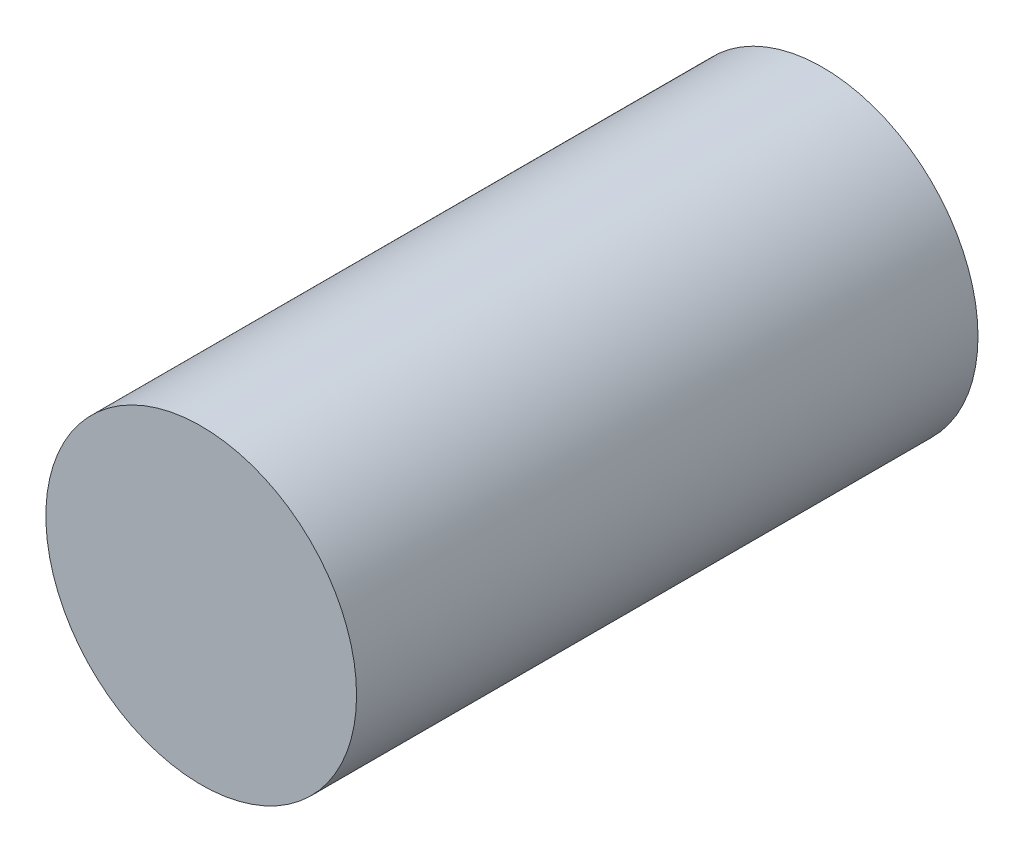
ISO-10303-21;
HEADER;
FILE_DESCRIPTION(('STEP AP214'),'2;1');
FILE_NAME('part.step','',(''),(''),'','','');
FILE_SCHEMA(('AUTOMOTIVE_DESIGN { 1 0 10303 214 1 1 1 1 }'));
ENDSEC;
DATA;
#1=APPLICATION_CONTEXT('core data for automotive mechanical design processes');
#2=APPLICATION_PROTOCOL_DEFINITION('international standard','automotive_design',2000,#1);
#3=PRODUCT_CONTEXT('',#1,'mechanical');
#4=PRODUCT('Part','Part','',(#3));
#5=PRODUCT_RELATED_PRODUCT_CATEGORY('part','',(#4));
#6=PRODUCT_DEFINITION_FORMATION('','',#4);
#7=PRODUCT_DEFINITION_CONTEXT('part definition',#1,'design');
#8=PRODUCT_DEFINITION('design','',#6,#7);
#9=PRODUCT_DEFINITION_SHAPE('','',#8);
#10=(LENGTH_UNIT() NAMED_UNIT(*) SI_UNIT(.MILLI.,.METRE.));
#11=(NAMED_UNIT(*) PLANE_ANGLE_UNIT() SI_UNIT($,.RADIAN.));
#12=(NAMED_UNIT(*) SI_UNIT($,.STERADIAN.) SOLID_ANGLE_UNIT());
#13=UNCERTAINTY_MEASURE_WITH_UNIT(LENGTH_MEASURE(1.E-05),#10,'distance_accuracy_value','');
#14=(GEOMETRIC_REPRESENTATION_CONTEXT(3) GLOBAL_UNCERTAINTY_ASSIGNED_CONTEXT((#13)) GLOBAL_UNIT_ASSIGNED_CONTEXT((#10,
#11,#12)) REPRESENTATION_CONTEXT('',''));
#15=CARTESIAN_POINT('',(0.,0.,0.));
#16=DIRECTION('',(0.,0.,1.));
#17=DIRECTION('',(1.,0.,0.));
#18=AXIS2_PLACEMENT_3D('',#15,#16,#17);
#19=CARTESIAN_POINT('',(0.,0.,55.));
#20=DIRECTION('',(0.,0.,-1.));
#21=DIRECTION('',(-1.,0.,0.));
#22=AXIS2_PLACEMENT_3D('',#19,#20,#21);
#23=CYLINDRICAL_SURFACE('',#22,27.5);
#24=CARTESIAN_POINT('',(0.,0.,55.));
#25=DIRECTION('',(0.,0.,1.));
#26=DIRECTION('',(1.,0.,0.));
#27=AXIS2_PLACEMENT_3D('',#24,#25,#26);
#28=CIRCLE('',#27,27.5);
#29=CARTESIAN_POINT('',(27.5,0.,55.));
#30=VERTEX_POINT('',#29);
#31=EDGE_CURVE('E10',#30,#30,#28,.T.);
#32=ORIENTED_EDGE('',*,*,#31,.F.);
#33=EDGE_LOOP('',(#32));
#34=FACE_BOUND('',#33,.T.);
#35=CARTESIAN_POINT('',(0.,0.,-55.));
#36=DIRECTION('',(0.,0.,1.));
#37=DIRECTION('',(1.,0.,0.));
#38=AXIS2_PLACEMENT_3D('',#35,#36,#37);
#39=CIRCLE('',#38,27.5);
#40=CARTESIAN_POINT('',(27.5,0.,-55.));
#41=VERTEX_POINT('',#40);
#42=EDGE_CURVE('E40',#41,#41,#39,.T.);
#43=ORIENTED_EDGE('',*,*,#42,.T.);
#44=EDGE_LOOP('',(#43));
#45=FACE_BOUND('',#44,.T.);
#46=ADVANCED_FACE('F37',(#34,#45),#23,.T.);
#47=CARTESIAN_POINT('',(0.,0.,55.));
#48=DIRECTION('',(0.,0.,1.));
#49=DIRECTION('',(1.,0.,0.));
#50=AXIS2_PLACEMENT_3D('',#47,#48,#49);
#51=PLANE('',#50);
#52=ORIENTED_EDGE('',*,*,#31,.T.);
#53=EDGE_LOOP('',(#52));
#54=FACE_BOUND('',#53,.T.);
#55=ADVANCED_FACE('F54',(#54),#51,.T.);
#56=CARTESIAN_POINT('',(0.,0.,-55.));
#57=DIRECTION('',(0.,0.,1.));
#58=DIRECTION('',(1.,0.,0.));
#59=AXIS2_PLACEMENT_3D('',#56,#57,#58);
#60=PLANE('',#59);
#61=ORIENTED_EDGE('',*,*,#42,.F.);
#62=EDGE_LOOP('',(#61));
#63=FACE_BOUND('',#62,.T.);
#64=ADVANCED_FACE('F52',(#63),#60,.F.);
#65=CLOSED_SHELL('',(#46,#55,#64));
#66=MANIFOLD_SOLID_BREP('B2',#65);
#67=ADVANCED_BREP_SHAPE_REPRESENTATION('',(#18,#66),#14);
#68=SHAPE_DEFINITION_REPRESENTATION(#9,#67);
ENDSEC;
END-ISO-10303-21;
